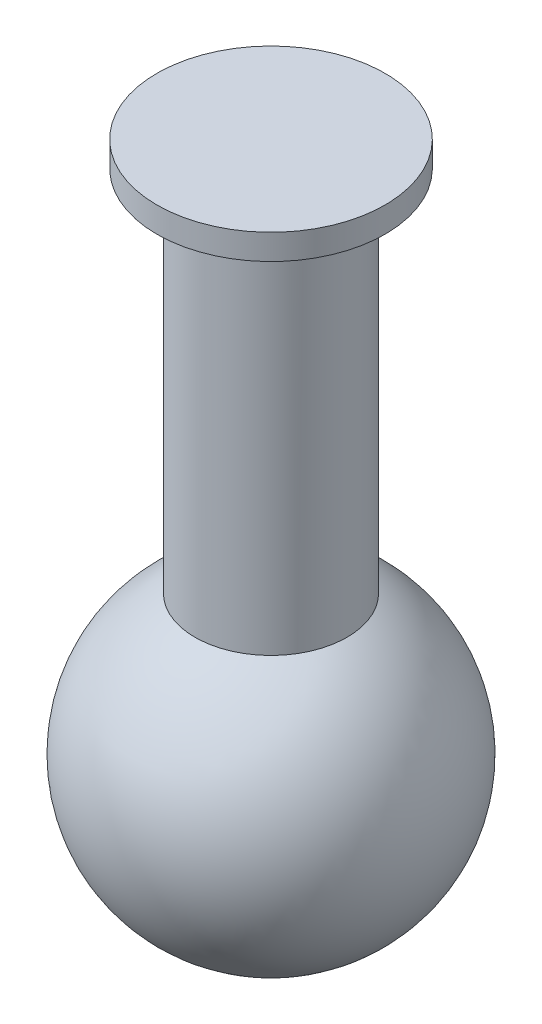
ISO-10303-21;
HEADER;
FILE_DESCRIPTION(('STEP AP214'),'2;1');
FILE_NAME('part.step','',(''),(''),'','','');
FILE_SCHEMA(('AUTOMOTIVE_DESIGN { 1 0 10303 214 1 1 1 1 }'));
ENDSEC;
DATA;
#1=APPLICATION_CONTEXT('core data for automotive mechanical design processes');
#2=APPLICATION_PROTOCOL_DEFINITION('international standard','automotive_design',2000,#1);
#3=PRODUCT_CONTEXT('',#1,'mechanical');
#4=PRODUCT('Part','Part','',(#3));
#5=PRODUCT_RELATED_PRODUCT_CATEGORY('part','',(#4));
#6=PRODUCT_DEFINITION_FORMATION('','',#4);
#7=PRODUCT_DEFINITION_CONTEXT('part definition',#1,'design');
#8=PRODUCT_DEFINITION('design','',#6,#7);
#9=PRODUCT_DEFINITION_SHAPE('','',#8);
#10=(LENGTH_UNIT() NAMED_UNIT(*) SI_UNIT(.MILLI.,.METRE.));
#11=(NAMED_UNIT(*) PLANE_ANGLE_UNIT() SI_UNIT($,.RADIAN.));
#12=(NAMED_UNIT(*) SI_UNIT($,.STERADIAN.) SOLID_ANGLE_UNIT());
#13=UNCERTAINTY_MEASURE_WITH_UNIT(LENGTH_MEASURE(1.E-05),#10,'distance_accuracy_value','');
#14=(GEOMETRIC_REPRESENTATION_CONTEXT(3) GLOBAL_UNCERTAINTY_ASSIGNED_CONTEXT((#13)) GLOBAL_UNIT_ASSIGNED_CONTEXT((#10,
#11,#12)) REPRESENTATION_CONTEXT('',''));
#15=CARTESIAN_POINT('',(0.,0.,0.));
#16=DIRECTION('',(0.,0.,1.));
#17=DIRECTION('',(1.,0.,0.));
#18=AXIS2_PLACEMENT_3D('',#15,#16,#17);
#19=CARTESIAN_POINT('',(0.,50.8,0.));
#20=DIRECTION('',(0.,-1.,0.));
#21=DIRECTION('',(0.,0.,-1.));
#22=AXIS2_PLACEMENT_3D('',#19,#20,#21);
#23=CYLINDRICAL_SURFACE('',#22,7.62);
#24=CARTESIAN_POINT('',(0.,13.9266372466579,0.));
#25=DIRECTION('',(0.,-1.,0.));
#26=DIRECTION('',(0.,0.,-1.));
#27=AXIS2_PLACEMENT_3D('',#24,#25,#26);
#28=CIRCLE('',#27,7.62);
#29=CARTESIAN_POINT('',(0.,13.9266372466579,-7.62));
#30=VERTEX_POINT('',#29);
#31=EDGE_CURVE('E10',#30,#30,#28,.T.);
#32=ORIENTED_EDGE('',*,*,#31,.F.);
#33=EDGE_LOOP('',(#32));
#34=FACE_BOUND('',#33,.T.);
#35=CARTESIAN_POINT('',(0.,50.8,0.));
#36=DIRECTION('',(0.,1.,0.));
#37=DIRECTION('',(0.,0.,1.));
#38=AXIS2_PLACEMENT_3D('',#35,#36,#37);
#39=CIRCLE('',#38,7.62);
#40=CARTESIAN_POINT('',(0.,50.8,7.62));
#41=VERTEX_POINT('',#40);
#42=EDGE_CURVE('E38',#41,#41,#39,.T.);
#43=ORIENTED_EDGE('',*,*,#42,.F.);
#44=EDGE_LOOP('',(#43));
#45=FACE_BOUND('',#44,.T.);
#46=ADVANCED_FACE('F31',(#34,#45),#23,.T.);
#47=CARTESIAN_POINT('',(0.,0.,0.));
#48=DIRECTION('',(0.,-1.,0.));
#49=DIRECTION('',(-1.,0.,0.));
#50=AXIS2_PLACEMENT_3D('',#47,#48,#49);
#51=SPHERICAL_SURFACE('',#50,15.875);
#52=ORIENTED_EDGE('',*,*,#31,.T.);
#53=EDGE_LOOP('',(#52));
#54=FACE_BOUND('',#53,.T.);
#55=ADVANCED_FACE('F33',(#54),#51,.T.);
#56=CARTESIAN_POINT('',(0.,53.34,0.));
#57=DIRECTION('',(0.,-1.,0.));
#58=DIRECTION('',(0.,0.,-1.));
#59=AXIS2_PLACEMENT_3D('',#56,#57,#58);
#60=CYLINDRICAL_SURFACE('',#59,11.43);
#61=CARTESIAN_POINT('',(0.,53.34,0.));
#62=DIRECTION('',(0.,1.,0.));
#63=DIRECTION('',(0.,0.,1.));
#64=AXIS2_PLACEMENT_3D('',#61,#62,#63);
#65=CIRCLE('',#64,11.43);
#66=CARTESIAN_POINT('',(0.,53.34,11.43));
#67=VERTEX_POINT('',#66);
#68=EDGE_CURVE('E42',#67,#67,#65,.T.);
#69=ORIENTED_EDGE('',*,*,#68,.F.);
#70=EDGE_LOOP('',(#69));
#71=FACE_BOUND('',#70,.T.);
#72=CARTESIAN_POINT('',(0.,50.8,0.));
#73=DIRECTION('',(0.,1.,0.));
#74=DIRECTION('',(0.,0.,1.));
#75=AXIS2_PLACEMENT_3D('',#72,#73,#74);
#76=CIRCLE('',#75,11.43);
#77=CARTESIAN_POINT('',(0.,50.8,11.43));
#78=VERTEX_POINT('',#77);
#79=EDGE_CURVE('E46',#78,#78,#76,.T.);
#80=ORIENTED_EDGE('',*,*,#79,.T.);
#81=EDGE_LOOP('',(#80));
#82=FACE_BOUND('',#81,.T.);
#83=ADVANCED_FACE('F52',(#71,#82),#60,.T.);
#84=CARTESIAN_POINT('',(0.,53.34,0.));
#85=DIRECTION('',(0.,1.,0.));
#86=DIRECTION('',(0.,0.,1.));
#87=AXIS2_PLACEMENT_3D('',#84,#85,#86);
#88=PLANE('',#87);
#89=ORIENTED_EDGE('',*,*,#68,.T.);
#90=EDGE_LOOP('',(#89));
#91=FACE_BOUND('',#90,.T.);
#92=ADVANCED_FACE('F56',(#91),#88,.T.);
#93=CARTESIAN_POINT('',(0.,50.8,0.));
#94=DIRECTION('',(0.,1.,0.));
#95=DIRECTION('',(0.,0.,1.));
#96=AXIS2_PLACEMENT_3D('',#93,#94,#95);
#97=PLANE('',#96);
#98=ORIENTED_EDGE('',*,*,#42,.T.);
#99=EDGE_LOOP('',(#98));
#100=FACE_BOUND('',#99,.T.);
#101=ORIENTED_EDGE('',*,*,#79,.F.);
#102=EDGE_LOOP('',(#101));
#103=FACE_BOUND('',#102,.T.);
#104=ADVANCED_FACE('F54',(#100,#103),#97,.F.);
#105=CLOSED_SHELL('',(#46,#55,#83,#92,#104));
#106=MANIFOLD_SOLID_BREP('B2',#105);
#107=ADVANCED_BREP_SHAPE_REPRESENTATION('',(#18,#106),#14);
#108=SHAPE_DEFINITION_REPRESENTATION(#9,#107);
ENDSEC;
END-ISO-10303-21;
